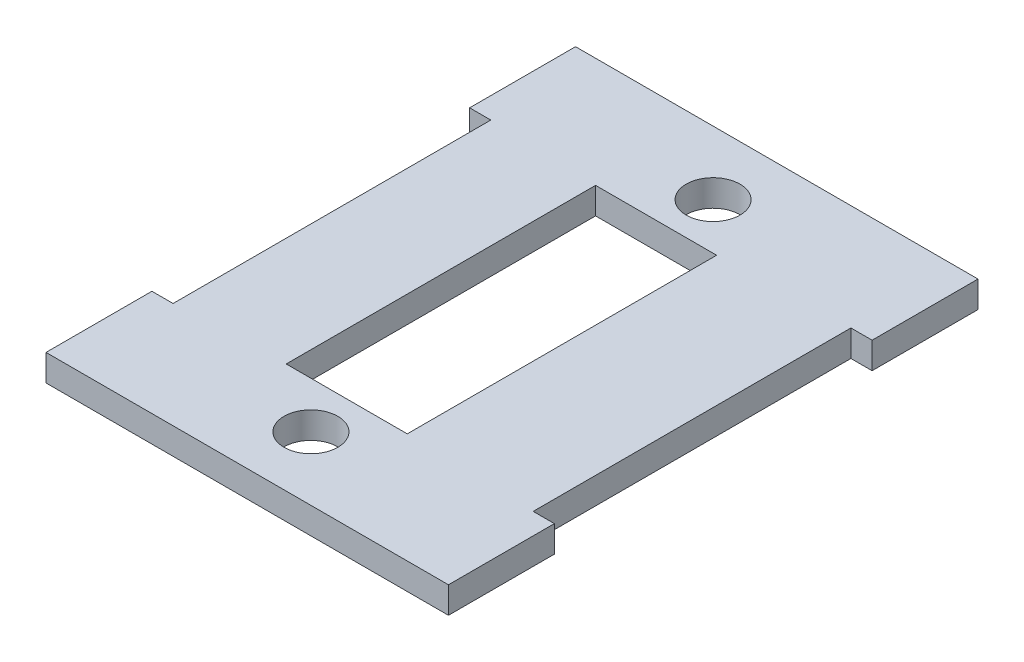
ISO-10303-21;
HEADER;
FILE_DESCRIPTION(('STEP AP214'),'2;1');
FILE_NAME('part.step','',(''),(''),'','','');
FILE_SCHEMA(('AUTOMOTIVE_DESIGN { 1 0 10303 214 1 1 1 1 }'));
ENDSEC;
DATA;
#1=APPLICATION_CONTEXT('core data for automotive mechanical design processes');
#2=APPLICATION_PROTOCOL_DEFINITION('international standard','automotive_design',2000,#1);
#3=PRODUCT_CONTEXT('',#1,'mechanical');
#4=PRODUCT('Part','Part','',(#3));
#5=PRODUCT_RELATED_PRODUCT_CATEGORY('part','',(#4));
#6=PRODUCT_DEFINITION_FORMATION('','',#4);
#7=PRODUCT_DEFINITION_CONTEXT('part definition',#1,'design');
#8=PRODUCT_DEFINITION('design','',#6,#7);
#9=PRODUCT_DEFINITION_SHAPE('','',#8);
#10=(LENGTH_UNIT() NAMED_UNIT(*) SI_UNIT(.MILLI.,.METRE.));
#11=(NAMED_UNIT(*) PLANE_ANGLE_UNIT() SI_UNIT($,.RADIAN.));
#12=(NAMED_UNIT(*) SI_UNIT($,.STERADIAN.) SOLID_ANGLE_UNIT());
#13=UNCERTAINTY_MEASURE_WITH_UNIT(LENGTH_MEASURE(1.E-05),#10,'distance_accuracy_value','');
#14=(GEOMETRIC_REPRESENTATION_CONTEXT(3) GLOBAL_UNCERTAINTY_ASSIGNED_CONTEXT((#13)) GLOBAL_UNIT_ASSIGNED_CONTEXT((#10,
#11,#12)) REPRESENTATION_CONTEXT('',''));
#15=CARTESIAN_POINT('',(0.,0.,0.));
#16=DIRECTION('',(0.,0.,1.));
#17=DIRECTION('',(1.,0.,0.));
#18=AXIS2_PLACEMENT_3D('',#15,#16,#17);
#19=CARTESIAN_POINT('',(20.,1.25,-15.));
#20=DIRECTION('',(0.,-1.,0.));
#21=DIRECTION('',(0.,0.,-1.));
#22=AXIS2_PLACEMENT_3D('',#19,#20,#21);
#23=PLANE('',#22);
#24=CARTESIAN_POINT('',(1.00000000000147,1.25,-18.9853700863915));
#25=DIRECTION('',(0.,1.,0.));
#26=DIRECTION('',(0.,0.,1.));
#27=AXIS2_PLACEMENT_3D('',#24,#25,#26);
#28=CIRCLE('',#27,2.53999999999995);
#29=CARTESIAN_POINT('',(1.00000000000147,1.25,-16.4453700863915));
#30=VERTEX_POINT('',#29);
#31=EDGE_CURVE('E173',#30,#30,#28,.T.);
#32=ORIENTED_EDGE('',*,*,#31,.F.);
#33=EDGE_LOOP('',(#32));
#34=FACE_BOUND('',#33,.T.);
#35=DIRECTION('',(0.,0.,-1.));
#36=VECTOR('',#35,1.);
#37=CARTESIAN_POINT('',(20.,1.25,-25.));
#38=LINE('',#37,#36);
#39=CARTESIAN_POINT('',(20.,1.25,-15.));
#40=VERTEX_POINT('',#39);
#41=CARTESIAN_POINT('',(20.,1.25,-25.));
#42=VERTEX_POINT('',#41);
#43=EDGE_CURVE('E183',#40,#42,#38,.T.);
#44=ORIENTED_EDGE('',*,*,#43,.T.);
#45=DIRECTION('',(-1.,0.,0.));
#46=VECTOR('',#45,1.);
#47=CARTESIAN_POINT('',(20.,1.25,-25.));
#48=LINE('',#47,#46);
#49=CARTESIAN_POINT('',(-18.,1.25,-25.));
#50=VERTEX_POINT('',#49);
#51=EDGE_CURVE('E186',#42,#50,#48,.T.);
#52=ORIENTED_EDGE('',*,*,#51,.T.);
#53=DIRECTION('',(0.,0.,1.));
#54=VECTOR('',#53,1.);
#55=CARTESIAN_POINT('',(-18.,1.25,-25.));
#56=LINE('',#55,#54);
#57=CARTESIAN_POINT('',(-18.,1.25,-15.));
#58=VERTEX_POINT('',#57);
#59=EDGE_CURVE('E189',#50,#58,#56,.T.);
#60=ORIENTED_EDGE('',*,*,#59,.T.);
#61=DIRECTION('',(1.,0.,0.));
#62=VECTOR('',#61,1.);
#63=CARTESIAN_POINT('',(-18.,1.25,-15.));
#64=LINE('',#63,#62);
#65=CARTESIAN_POINT('',(-16.,1.25,-15.));
#66=VERTEX_POINT('',#65);
#67=EDGE_CURVE('E191',#58,#66,#64,.T.);
#68=ORIENTED_EDGE('',*,*,#67,.T.);
#69=DIRECTION('',(0.,0.,1.));
#70=VECTOR('',#69,1.);
#71=CARTESIAN_POINT('',(-16.,1.25,15.));
#72=LINE('',#71,#70);
#73=CARTESIAN_POINT('',(-16.,1.25,15.));
#74=VERTEX_POINT('',#73);
#75=EDGE_CURVE('E193',#66,#74,#72,.T.);
#76=ORIENTED_EDGE('',*,*,#75,.T.);
#77=DIRECTION('',(-1.,0.,0.));
#78=VECTOR('',#77,1.);
#79=CARTESIAN_POINT('',(-18.,1.25,15.));
#80=LINE('',#79,#78);
#81=CARTESIAN_POINT('',(-18.,1.25,15.));
#82=VERTEX_POINT('',#81);
#83=EDGE_CURVE('E195',#74,#82,#80,.T.);
#84=ORIENTED_EDGE('',*,*,#83,.T.);
#85=DIRECTION('',(0.,0.,1.));
#86=VECTOR('',#85,1.);
#87=CARTESIAN_POINT('',(-18.,1.25,25.));
#88=LINE('',#87,#86);
#89=CARTESIAN_POINT('',(-18.,1.25,25.));
#90=VERTEX_POINT('',#89);
#91=EDGE_CURVE('E197',#82,#90,#88,.T.);
#92=ORIENTED_EDGE('',*,*,#91,.T.);
#93=DIRECTION('',(1.,0.,0.));
#94=VECTOR('',#93,1.);
#95=CARTESIAN_POINT('',(-18.,1.25,25.));
#96=LINE('',#95,#94);
#97=CARTESIAN_POINT('',(20.,1.25,25.));
#98=VERTEX_POINT('',#97);
#99=EDGE_CURVE('E199',#90,#98,#96,.T.);
#100=ORIENTED_EDGE('',*,*,#99,.T.);
#101=DIRECTION('',(0.,0.,-1.));
#102=VECTOR('',#101,1.);
#103=CARTESIAN_POINT('',(20.,1.25,25.));
#104=LINE('',#103,#102);
#105=CARTESIAN_POINT('',(20.,1.25,15.));
#106=VERTEX_POINT('',#105);
#107=EDGE_CURVE('E201',#98,#106,#104,.T.);
#108=ORIENTED_EDGE('',*,*,#107,.T.);
#109=DIRECTION('',(-1.,0.,0.));
#110=VECTOR('',#109,1.);
#111=CARTESIAN_POINT('',(20.,1.25,15.));
#112=LINE('',#111,#110);
#113=CARTESIAN_POINT('',(18.,1.25,15.));
#114=VERTEX_POINT('',#113);
#115=EDGE_CURVE('E203',#106,#114,#112,.T.);
#116=ORIENTED_EDGE('',*,*,#115,.T.);
#117=DIRECTION('',(0.,0.,-1.));
#118=VECTOR('',#117,1.);
#119=CARTESIAN_POINT('',(18.,1.25,15.));
#120=LINE('',#119,#118);
#121=CARTESIAN_POINT('',(18.,1.25,-15.));
#122=VERTEX_POINT('',#121);
#123=EDGE_CURVE('E205',#114,#122,#120,.T.);
#124=ORIENTED_EDGE('',*,*,#123,.T.);
#125=DIRECTION('',(1.,0.,0.));
#126=VECTOR('',#125,1.);
#127=CARTESIAN_POINT('',(20.,1.25,-15.));
#128=LINE('',#127,#126);
#129=EDGE_CURVE('E207',#122,#40,#128,.T.);
#130=ORIENTED_EDGE('',*,*,#129,.T.);
#131=EDGE_LOOP('',(#44,#52,#60,#68,#76,#84,#92,#100,#108,#116,#124,#130));
#132=FACE_BOUND('',#131,.T.);
#133=DIRECTION('',(0.,0.,1.));
#134=VECTOR('',#133,1.);
#135=CARTESIAN_POINT('',(-5.715,1.25,14.605));
#136=LINE('',#135,#134);
#137=CARTESIAN_POINT('',(-5.715,1.25,-14.605));
#138=VERTEX_POINT('',#137);
#139=CARTESIAN_POINT('',(-5.715,1.25,14.605));
#140=VERTEX_POINT('',#139);
#141=EDGE_CURVE('E144',#138,#140,#136,.T.);
#142=ORIENTED_EDGE('',*,*,#141,.F.);
#143=DIRECTION('',(-1.,0.,0.));
#144=VECTOR('',#143,1.);
#145=CARTESIAN_POINT('',(5.715,1.25,-14.605));
#146=LINE('',#145,#144);
#147=CARTESIAN_POINT('',(5.715,1.25,-14.605));
#148=VERTEX_POINT('',#147);
#149=EDGE_CURVE('E167',#148,#138,#146,.T.);
#150=ORIENTED_EDGE('',*,*,#149,.F.);
#151=DIRECTION('',(0.,0.,-1.));
#152=VECTOR('',#151,1.);
#153=CARTESIAN_POINT('',(5.715,1.25,14.605));
#154=LINE('',#153,#152);
#155=CARTESIAN_POINT('',(5.715,1.25,14.605));
#156=VERTEX_POINT('',#155);
#157=EDGE_CURVE('E165',#156,#148,#154,.T.);
#158=ORIENTED_EDGE('',*,*,#157,.F.);
#159=DIRECTION('',(1.,0.,0.));
#160=VECTOR('',#159,1.);
#161=CARTESIAN_POINT('',(5.715,1.25,14.605));
#162=LINE('',#161,#160);
#163=EDGE_CURVE('E152',#140,#156,#162,.T.);
#164=ORIENTED_EDGE('',*,*,#163,.F.);
#165=EDGE_LOOP('',(#142,#150,#158,#164));
#166=FACE_BOUND('',#165,.T.);
#167=CARTESIAN_POINT('',(1.00000000000147,1.25,18.9853700863915));
#168=DIRECTION('',(0.,1.,0.));
#169=DIRECTION('',(0.,0.,1.));
#170=AXIS2_PLACEMENT_3D('',#167,#168,#169);
#171=CIRCLE('',#170,2.54000000000003);
#172=CARTESIAN_POINT('',(1.00000000000147,1.25,21.5253700863915));
#173=VERTEX_POINT('',#172);
#174=EDGE_CURVE('E494',#173,#173,#171,.T.);
#175=ORIENTED_EDGE('',*,*,#174,.F.);
#176=EDGE_LOOP('',(#175));
#177=FACE_BOUND('',#176,.T.);
#178=ADVANCED_FACE('F31',(#34,#132,#166,#177),#23,.F.);
#179=CARTESIAN_POINT('',(20.,-1.25,-15.));
#180=DIRECTION('',(0.,-1.,0.));
#181=DIRECTION('',(0.,0.,-1.));
#182=AXIS2_PLACEMENT_3D('',#179,#180,#181);
#183=PLANE('',#182);
#184=CARTESIAN_POINT('',(1.00000000000147,-1.25,-18.9853700863915));
#185=DIRECTION('',(0.,1.,0.));
#186=DIRECTION('',(0.,0.,1.));
#187=AXIS2_PLACEMENT_3D('',#184,#185,#186);
#188=CIRCLE('',#187,2.53999999999995);
#189=CARTESIAN_POINT('',(1.00000000000147,-1.25,-16.4453700863915));
#190=VERTEX_POINT('',#189);
#191=EDGE_CURVE('E500',#190,#190,#188,.T.);
#192=ORIENTED_EDGE('',*,*,#191,.T.);
#193=EDGE_LOOP('',(#192));
#194=FACE_BOUND('',#193,.T.);
#195=DIRECTION('',(0.,0.,-1.));
#196=VECTOR('',#195,1.);
#197=CARTESIAN_POINT('',(20.,-1.25,-25.));
#198=LINE('',#197,#196);
#199=CARTESIAN_POINT('',(20.,-1.25,-15.));
#200=VERTEX_POINT('',#199);
#201=CARTESIAN_POINT('',(20.,-1.25,-25.));
#202=VERTEX_POINT('',#201);
#203=EDGE_CURVE('E160',#200,#202,#198,.T.);
#204=ORIENTED_EDGE('',*,*,#203,.F.);
#205=DIRECTION('',(1.,0.,0.));
#206=VECTOR('',#205,1.);
#207=CARTESIAN_POINT('',(20.,-1.25,-15.));
#208=LINE('',#207,#206);
#209=CARTESIAN_POINT('',(18.,-1.25,-15.));
#210=VERTEX_POINT('',#209);
#211=EDGE_CURVE('E187',#210,#200,#208,.T.);
#212=ORIENTED_EDGE('',*,*,#211,.F.);
#213=DIRECTION('',(0.,0.,-1.));
#214=VECTOR('',#213,1.);
#215=CARTESIAN_POINT('',(18.,-1.25,15.));
#216=LINE('',#215,#214);
#217=CARTESIAN_POINT('',(18.,-1.25,15.));
#218=VERTEX_POINT('',#217);
#219=EDGE_CURVE('E230',#218,#210,#216,.T.);
#220=ORIENTED_EDGE('',*,*,#219,.F.);
#221=DIRECTION('',(-1.,0.,0.));
#222=VECTOR('',#221,1.);
#223=CARTESIAN_POINT('',(20.,-1.25,15.));
#224=LINE('',#223,#222);
#225=CARTESIAN_POINT('',(20.,-1.25,15.));
#226=VERTEX_POINT('',#225);
#227=EDGE_CURVE('E228',#226,#218,#224,.T.);
#228=ORIENTED_EDGE('',*,*,#227,.F.);
#229=DIRECTION('',(0.,0.,-1.));
#230=VECTOR('',#229,1.);
#231=CARTESIAN_POINT('',(20.,-1.25,25.));
#232=LINE('',#231,#230);
#233=CARTESIAN_POINT('',(20.,-1.25,25.));
#234=VERTEX_POINT('',#233);
#235=EDGE_CURVE('E226',#234,#226,#232,.T.);
#236=ORIENTED_EDGE('',*,*,#235,.F.);
#237=DIRECTION('',(1.,0.,0.));
#238=VECTOR('',#237,1.);
#239=CARTESIAN_POINT('',(-18.,-1.25,25.));
#240=LINE('',#239,#238);
#241=CARTESIAN_POINT('',(-18.,-1.25,25.));
#242=VERTEX_POINT('',#241);
#243=EDGE_CURVE('E224',#242,#234,#240,.T.);
#244=ORIENTED_EDGE('',*,*,#243,.F.);
#245=DIRECTION('',(0.,0.,1.));
#246=VECTOR('',#245,1.);
#247=CARTESIAN_POINT('',(-18.,-1.25,25.));
#248=LINE('',#247,#246);
#249=CARTESIAN_POINT('',(-18.,-1.25,15.));
#250=VERTEX_POINT('',#249);
#251=EDGE_CURVE('E222',#250,#242,#248,.T.);
#252=ORIENTED_EDGE('',*,*,#251,.F.);
#253=DIRECTION('',(-1.,0.,0.));
#254=VECTOR('',#253,1.);
#255=CARTESIAN_POINT('',(-18.,-1.25,15.));
#256=LINE('',#255,#254);
#257=CARTESIAN_POINT('',(-16.,-1.25,15.));
#258=VERTEX_POINT('',#257);
#259=EDGE_CURVE('E220',#258,#250,#256,.T.);
#260=ORIENTED_EDGE('',*,*,#259,.F.);
#261=DIRECTION('',(0.,0.,1.));
#262=VECTOR('',#261,1.);
#263=CARTESIAN_POINT('',(-16.,-1.25,15.));
#264=LINE('',#263,#262);
#265=CARTESIAN_POINT('',(-16.,-1.25,-15.));
#266=VERTEX_POINT('',#265);
#267=EDGE_CURVE('E218',#266,#258,#264,.T.);
#268=ORIENTED_EDGE('',*,*,#267,.F.);
#269=DIRECTION('',(1.,0.,0.));
#270=VECTOR('',#269,1.);
#271=CARTESIAN_POINT('',(-18.,-1.25,-15.));
#272=LINE('',#271,#270);
#273=CARTESIAN_POINT('',(-18.,-1.25,-15.));
#274=VERTEX_POINT('',#273);
#275=EDGE_CURVE('E216',#274,#266,#272,.T.);
#276=ORIENTED_EDGE('',*,*,#275,.F.);
#277=DIRECTION('',(0.,0.,1.));
#278=VECTOR('',#277,1.);
#279=CARTESIAN_POINT('',(-18.,-1.25,-25.));
#280=LINE('',#279,#278);
#281=CARTESIAN_POINT('',(-18.,-1.25,-25.));
#282=VERTEX_POINT('',#281);
#283=EDGE_CURVE('E214',#282,#274,#280,.T.);
#284=ORIENTED_EDGE('',*,*,#283,.F.);
#285=DIRECTION('',(-1.,0.,0.));
#286=VECTOR('',#285,1.);
#287=CARTESIAN_POINT('',(20.,-1.25,-25.));
#288=LINE('',#287,#286);
#289=EDGE_CURVE('E212',#202,#282,#288,.T.);
#290=ORIENTED_EDGE('',*,*,#289,.F.);
#291=EDGE_LOOP('',(#204,#212,#220,#228,#236,#244,#252,#260,#268,#276,#284,#290));
#292=FACE_BOUND('',#291,.T.);
#293=DIRECTION('',(-1.,0.,0.));
#294=VECTOR('',#293,1.);
#295=CARTESIAN_POINT('',(5.715,-1.25,-14.605));
#296=LINE('',#295,#294);
#297=CARTESIAN_POINT('',(5.715,-1.25,-14.605));
#298=VERTEX_POINT('',#297);
#299=CARTESIAN_POINT('',(-5.71499999999999,-1.25,-14.605));
#300=VERTEX_POINT('',#299);
#301=EDGE_CURVE('E153',#298,#300,#296,.T.);
#302=ORIENTED_EDGE('',*,*,#301,.T.);
#303=DIRECTION('',(0.,0.,1.));
#304=VECTOR('',#303,1.);
#305=CARTESIAN_POINT('',(-5.715,-1.25,14.605));
#306=LINE('',#305,#304);
#307=CARTESIAN_POINT('',(-5.715,-1.25,14.605));
#308=VERTEX_POINT('',#307);
#309=EDGE_CURVE('E54',#300,#308,#306,.T.);
#310=ORIENTED_EDGE('',*,*,#309,.T.);
#311=DIRECTION('',(1.,0.,0.));
#312=VECTOR('',#311,1.);
#313=CARTESIAN_POINT('',(5.715,-1.25,14.605));
#314=LINE('',#313,#312);
#315=CARTESIAN_POINT('',(5.715,-1.25,14.605));
#316=VERTEX_POINT('',#315);
#317=EDGE_CURVE('E159',#308,#316,#314,.T.);
#318=ORIENTED_EDGE('',*,*,#317,.T.);
#319=DIRECTION('',(0.,0.,-1.));
#320=VECTOR('',#319,1.);
#321=CARTESIAN_POINT('',(5.715,-1.25,14.605));
#322=LINE('',#321,#320);
#323=EDGE_CURVE('E175',#316,#298,#322,.T.);
#324=ORIENTED_EDGE('',*,*,#323,.T.);
#325=EDGE_LOOP('',(#302,#310,#318,#324));
#326=FACE_BOUND('',#325,.T.);
#327=CARTESIAN_POINT('',(1.00000000000147,-1.25,18.9853700863915));
#328=DIRECTION('',(0.,1.,0.));
#329=DIRECTION('',(0.,0.,1.));
#330=AXIS2_PLACEMENT_3D('',#327,#328,#329);
#331=CIRCLE('',#330,2.54000000000003);
#332=CARTESIAN_POINT('',(1.00000000000147,-1.25,21.5253700863915));
#333=VERTEX_POINT('',#332);
#334=EDGE_CURVE('E497',#333,#333,#331,.T.);
#335=ORIENTED_EDGE('',*,*,#334,.T.);
#336=EDGE_LOOP('',(#335));
#337=FACE_BOUND('',#336,.T.);
#338=ADVANCED_FACE('F272',(#194,#292,#326,#337),#183,.T.);
#339=CARTESIAN_POINT('',(20.,1.25,-25.));
#340=DIRECTION('',(-1.,0.,0.));
#341=DIRECTION('',(0.,0.,1.));
#342=AXIS2_PLACEMENT_3D('',#339,#340,#341);
#343=PLANE('',#342);
#344=ORIENTED_EDGE('',*,*,#203,.T.);
#345=DIRECTION('',(0.,-1.,0.));
#346=VECTOR('',#345,1.);
#347=CARTESIAN_POINT('',(20.,1.25,-25.));
#348=LINE('',#347,#346);
#349=EDGE_CURVE('E11',#42,#202,#348,.T.);
#350=ORIENTED_EDGE('',*,*,#349,.F.);
#351=ORIENTED_EDGE('',*,*,#43,.F.);
#352=DIRECTION('',(0.,-1.,0.));
#353=VECTOR('',#352,1.);
#354=CARTESIAN_POINT('',(20.,1.25,-15.));
#355=LINE('',#354,#353);
#356=EDGE_CURVE('E209',#40,#200,#355,.T.);
#357=ORIENTED_EDGE('',*,*,#356,.T.);
#358=EDGE_LOOP('',(#344,#350,#351,#357));
#359=FACE_BOUND('',#358,.T.);
#360=ADVANCED_FACE('F33',(#359),#343,.F.);
#361=CARTESIAN_POINT('',(20.,1.25,-25.));
#362=DIRECTION('',(0.,0.,1.));
#363=DIRECTION('',(1.,0.,0.));
#364=AXIS2_PLACEMENT_3D('',#361,#362,#363);
#365=PLANE('',#364);
#366=ORIENTED_EDGE('',*,*,#289,.T.);
#367=DIRECTION('',(0.,-1.,0.));
#368=VECTOR('',#367,1.);
#369=CARTESIAN_POINT('',(-18.,1.25,-25.));
#370=LINE('',#369,#368);
#371=EDGE_CURVE('E39',#50,#282,#370,.T.);
#372=ORIENTED_EDGE('',*,*,#371,.F.);
#373=ORIENTED_EDGE('',*,*,#51,.F.);
#374=ORIENTED_EDGE('',*,*,#349,.T.);
#375=EDGE_LOOP('',(#366,#372,#373,#374));
#376=FACE_BOUND('',#375,.T.);
#377=ADVANCED_FACE('F289',(#376),#365,.F.);
#378=CARTESIAN_POINT('',(-18.,1.25,-25.));
#379=DIRECTION('',(1.,0.,0.));
#380=DIRECTION('',(0.,0.,-1.));
#381=AXIS2_PLACEMENT_3D('',#378,#379,#380);
#382=PLANE('',#381);
#383=ORIENTED_EDGE('',*,*,#283,.T.);
#384=DIRECTION('',(0.,-1.,0.));
#385=VECTOR('',#384,1.);
#386=CARTESIAN_POINT('',(-18.,1.25,-15.));
#387=LINE('',#386,#385);
#388=EDGE_CURVE('E259',#58,#274,#387,.T.);
#389=ORIENTED_EDGE('',*,*,#388,.F.);
#390=ORIENTED_EDGE('',*,*,#59,.F.);
#391=ORIENTED_EDGE('',*,*,#371,.T.);
#392=EDGE_LOOP('',(#383,#389,#390,#391));
#393=FACE_BOUND('',#392,.T.);
#394=ADVANCED_FACE('F266',(#393),#382,.F.);
#395=CARTESIAN_POINT('',(-18.,1.25,-15.));
#396=DIRECTION('',(0.,0.,-1.));
#397=DIRECTION('',(-1.,0.,0.));
#398=AXIS2_PLACEMENT_3D('',#395,#396,#397);
#399=PLANE('',#398);
#400=ORIENTED_EDGE('',*,*,#275,.T.);
#401=DIRECTION('',(0.,-1.,0.));
#402=VECTOR('',#401,1.);
#403=CARTESIAN_POINT('',(-16.,1.25,-15.));
#404=LINE('',#403,#402);
#405=EDGE_CURVE('E256',#66,#266,#404,.T.);
#406=ORIENTED_EDGE('',*,*,#405,.F.);
#407=ORIENTED_EDGE('',*,*,#67,.F.);
#408=ORIENTED_EDGE('',*,*,#388,.T.);
#409=EDGE_LOOP('',(#400,#406,#407,#408));
#410=FACE_BOUND('',#409,.T.);
#411=ADVANCED_FACE('F278',(#410),#399,.F.);
#412=CARTESIAN_POINT('',(-16.,1.25,15.));
#413=DIRECTION('',(1.,0.,0.));
#414=DIRECTION('',(0.,0.,-1.));
#415=AXIS2_PLACEMENT_3D('',#412,#413,#414);
#416=PLANE('',#415);
#417=ORIENTED_EDGE('',*,*,#267,.T.);
#418=DIRECTION('',(0.,-1.,0.));
#419=VECTOR('',#418,1.);
#420=CARTESIAN_POINT('',(-16.,1.25,15.));
#421=LINE('',#420,#419);
#422=EDGE_CURVE('E253',#74,#258,#421,.T.);
#423=ORIENTED_EDGE('',*,*,#422,.F.);
#424=ORIENTED_EDGE('',*,*,#75,.F.);
#425=ORIENTED_EDGE('',*,*,#405,.T.);
#426=EDGE_LOOP('',(#417,#423,#424,#425));
#427=FACE_BOUND('',#426,.T.);
#428=ADVANCED_FACE('F282',(#427),#416,.F.);
#429=CARTESIAN_POINT('',(-18.,1.25,15.));
#430=DIRECTION('',(0.,0.,1.));
#431=DIRECTION('',(1.,0.,0.));
#432=AXIS2_PLACEMENT_3D('',#429,#430,#431);
#433=PLANE('',#432);
#434=ORIENTED_EDGE('',*,*,#259,.T.);
#435=DIRECTION('',(0.,-1.,0.));
#436=VECTOR('',#435,1.);
#437=CARTESIAN_POINT('',(-18.,1.25,15.));
#438=LINE('',#437,#436);
#439=EDGE_CURVE('E250',#82,#250,#438,.T.);
#440=ORIENTED_EDGE('',*,*,#439,.F.);
#441=ORIENTED_EDGE('',*,*,#83,.F.);
#442=ORIENTED_EDGE('',*,*,#422,.T.);
#443=EDGE_LOOP('',(#434,#440,#441,#442));
#444=FACE_BOUND('',#443,.T.);
#445=ADVANCED_FACE('F322',(#444),#433,.F.);
#446=CARTESIAN_POINT('',(-18.,1.25,25.));
#447=DIRECTION('',(1.,0.,0.));
#448=DIRECTION('',(0.,0.,-1.));
#449=AXIS2_PLACEMENT_3D('',#446,#447,#448);
#450=PLANE('',#449);
#451=ORIENTED_EDGE('',*,*,#251,.T.);
#452=DIRECTION('',(0.,-1.,0.));
#453=VECTOR('',#452,1.);
#454=CARTESIAN_POINT('',(-18.,1.25,25.));
#455=LINE('',#454,#453);
#456=EDGE_CURVE('E247',#90,#242,#455,.T.);
#457=ORIENTED_EDGE('',*,*,#456,.F.);
#458=ORIENTED_EDGE('',*,*,#91,.F.);
#459=ORIENTED_EDGE('',*,*,#439,.T.);
#460=EDGE_LOOP('',(#451,#457,#458,#459));
#461=FACE_BOUND('',#460,.T.);
#462=ADVANCED_FACE('F320',(#461),#450,.F.);
#463=CARTESIAN_POINT('',(-18.,1.25,25.));
#464=DIRECTION('',(0.,0.,-1.));
#465=DIRECTION('',(-1.,0.,0.));
#466=AXIS2_PLACEMENT_3D('',#463,#464,#465);
#467=PLANE('',#466);
#468=ORIENTED_EDGE('',*,*,#243,.T.);
#469=DIRECTION('',(0.,-1.,0.));
#470=VECTOR('',#469,1.);
#471=CARTESIAN_POINT('',(20.,1.25,25.));
#472=LINE('',#471,#470);
#473=EDGE_CURVE('E244',#98,#234,#472,.T.);
#474=ORIENTED_EDGE('',*,*,#473,.F.);
#475=ORIENTED_EDGE('',*,*,#99,.F.);
#476=ORIENTED_EDGE('',*,*,#456,.T.);
#477=EDGE_LOOP('',(#468,#474,#475,#476));
#478=FACE_BOUND('',#477,.T.);
#479=ADVANCED_FACE('F316',(#478),#467,.F.);
#480=CARTESIAN_POINT('',(20.,1.25,25.));
#481=DIRECTION('',(-1.,0.,0.));
#482=DIRECTION('',(0.,0.,1.));
#483=AXIS2_PLACEMENT_3D('',#480,#481,#482);
#484=PLANE('',#483);
#485=ORIENTED_EDGE('',*,*,#235,.T.);
#486=DIRECTION('',(0.,-1.,0.));
#487=VECTOR('',#486,1.);
#488=CARTESIAN_POINT('',(20.,1.25,15.));
#489=LINE('',#488,#487);
#490=EDGE_CURVE('E241',#106,#226,#489,.T.);
#491=ORIENTED_EDGE('',*,*,#490,.F.);
#492=ORIENTED_EDGE('',*,*,#107,.F.);
#493=ORIENTED_EDGE('',*,*,#473,.T.);
#494=EDGE_LOOP('',(#485,#491,#492,#493));
#495=FACE_BOUND('',#494,.T.);
#496=ADVANCED_FACE('F311',(#495),#484,.F.);
#497=CARTESIAN_POINT('',(20.,1.25,15.));
#498=DIRECTION('',(0.,0.,1.));
#499=DIRECTION('',(1.,0.,0.));
#500=AXIS2_PLACEMENT_3D('',#497,#498,#499);
#501=PLANE('',#500);
#502=ORIENTED_EDGE('',*,*,#227,.T.);
#503=DIRECTION('',(0.,-1.,0.));
#504=VECTOR('',#503,1.);
#505=CARTESIAN_POINT('',(18.,1.25,15.));
#506=LINE('',#505,#504);
#507=EDGE_CURVE('E238',#114,#218,#506,.T.);
#508=ORIENTED_EDGE('',*,*,#507,.F.);
#509=ORIENTED_EDGE('',*,*,#115,.F.);
#510=ORIENTED_EDGE('',*,*,#490,.T.);
#511=EDGE_LOOP('',(#502,#508,#509,#510));
#512=FACE_BOUND('',#511,.T.);
#513=ADVANCED_FACE('F305',(#512),#501,.F.);
#514=CARTESIAN_POINT('',(18.,1.25,15.));
#515=DIRECTION('',(-1.,0.,0.));
#516=DIRECTION('',(0.,0.,1.));
#517=AXIS2_PLACEMENT_3D('',#514,#515,#516);
#518=PLANE('',#517);
#519=ORIENTED_EDGE('',*,*,#219,.T.);
#520=DIRECTION('',(0.,-1.,0.));
#521=VECTOR('',#520,1.);
#522=CARTESIAN_POINT('',(18.,1.25,-15.));
#523=LINE('',#522,#521);
#524=EDGE_CURVE('E235',#122,#210,#523,.T.);
#525=ORIENTED_EDGE('',*,*,#524,.F.);
#526=ORIENTED_EDGE('',*,*,#123,.F.);
#527=ORIENTED_EDGE('',*,*,#507,.T.);
#528=EDGE_LOOP('',(#519,#525,#526,#527));
#529=FACE_BOUND('',#528,.T.);
#530=ADVANCED_FACE('F301',(#529),#518,.F.);
#531=CARTESIAN_POINT('',(20.,1.25,-15.));
#532=DIRECTION('',(0.,0.,-1.));
#533=DIRECTION('',(-1.,0.,0.));
#534=AXIS2_PLACEMENT_3D('',#531,#532,#533);
#535=PLANE('',#534);
#536=ORIENTED_EDGE('',*,*,#211,.T.);
#537=ORIENTED_EDGE('',*,*,#356,.F.);
#538=ORIENTED_EDGE('',*,*,#129,.F.);
#539=ORIENTED_EDGE('',*,*,#524,.T.);
#540=EDGE_LOOP('',(#536,#537,#538,#539));
#541=FACE_BOUND('',#540,.T.);
#542=ADVANCED_FACE('F296',(#541),#535,.F.);
#543=CARTESIAN_POINT('',(-5.715,1.25,14.605));
#544=DIRECTION('',(1.,0.,0.));
#545=DIRECTION('',(0.,0.,-1.));
#546=AXIS2_PLACEMENT_3D('',#543,#544,#545);
#547=PLANE('',#546);
#548=ORIENTED_EDGE('',*,*,#309,.F.);
#549=DIRECTION('',(0.,-1.,0.));
#550=VECTOR('',#549,1.);
#551=CARTESIAN_POINT('',(-5.715,1.25,-14.605));
#552=LINE('',#551,#550);
#553=EDGE_CURVE('E148',#138,#300,#552,.T.);
#554=ORIENTED_EDGE('',*,*,#553,.F.);
#555=ORIENTED_EDGE('',*,*,#141,.T.);
#556=DIRECTION('',(0.,-1.,0.));
#557=VECTOR('',#556,1.);
#558=CARTESIAN_POINT('',(-5.715,1.25,14.605));
#559=LINE('',#558,#557);
#560=EDGE_CURVE('E147',#140,#308,#559,.T.);
#561=ORIENTED_EDGE('',*,*,#560,.T.);
#562=EDGE_LOOP('',(#548,#554,#555,#561));
#563=FACE_BOUND('',#562,.T.);
#564=ADVANCED_FACE('F146',(#563),#547,.T.);
#565=CARTESIAN_POINT('',(5.715,1.25,14.605));
#566=DIRECTION('',(0.,0.,-1.));
#567=DIRECTION('',(-1.,0.,0.));
#568=AXIS2_PLACEMENT_3D('',#565,#566,#567);
#569=PLANE('',#568);
#570=ORIENTED_EDGE('',*,*,#317,.F.);
#571=ORIENTED_EDGE('',*,*,#560,.F.);
#572=ORIENTED_EDGE('',*,*,#163,.T.);
#573=DIRECTION('',(0.,-1.,0.));
#574=VECTOR('',#573,1.);
#575=CARTESIAN_POINT('',(5.715,1.25,14.605));
#576=LINE('',#575,#574);
#577=EDGE_CURVE('E161',#156,#316,#576,.T.);
#578=ORIENTED_EDGE('',*,*,#577,.T.);
#579=EDGE_LOOP('',(#570,#571,#572,#578));
#580=FACE_BOUND('',#579,.T.);
#581=ADVANCED_FACE('F156',(#580),#569,.T.);
#582=CARTESIAN_POINT('',(5.715,1.25,14.605));
#583=DIRECTION('',(-1.,0.,0.));
#584=DIRECTION('',(0.,0.,1.));
#585=AXIS2_PLACEMENT_3D('',#582,#583,#584);
#586=PLANE('',#585);
#587=ORIENTED_EDGE('',*,*,#323,.F.);
#588=ORIENTED_EDGE('',*,*,#577,.F.);
#589=ORIENTED_EDGE('',*,*,#157,.T.);
#590=DIRECTION('',(0.,-1.,0.));
#591=VECTOR('',#590,1.);
#592=CARTESIAN_POINT('',(5.715,1.25,-14.605));
#593=LINE('',#592,#591);
#594=EDGE_CURVE('E46',#148,#298,#593,.T.);
#595=ORIENTED_EDGE('',*,*,#594,.T.);
#596=EDGE_LOOP('',(#587,#588,#589,#595));
#597=FACE_BOUND('',#596,.T.);
#598=ADVANCED_FACE('F383',(#597),#586,.T.);
#599=CARTESIAN_POINT('',(5.715,1.25,-14.605));
#600=DIRECTION('',(0.,0.,1.));
#601=DIRECTION('',(1.,0.,0.));
#602=AXIS2_PLACEMENT_3D('',#599,#600,#601);
#603=PLANE('',#602);
#604=ORIENTED_EDGE('',*,*,#301,.F.);
#605=ORIENTED_EDGE('',*,*,#594,.F.);
#606=ORIENTED_EDGE('',*,*,#149,.T.);
#607=ORIENTED_EDGE('',*,*,#553,.T.);
#608=EDGE_LOOP('',(#604,#605,#606,#607));
#609=FACE_BOUND('',#608,.T.);
#610=ADVANCED_FACE('F389',(#609),#603,.T.);
#611=CARTESIAN_POINT('',(1.00000000000147,1.25,-18.9853700863915));
#612=DIRECTION('',(0.,-1.,0.));
#613=DIRECTION('',(0.,0.,-1.));
#614=AXIS2_PLACEMENT_3D('',#611,#612,#613);
#615=CYLINDRICAL_SURFACE('',#614,2.53999999999995);
#616=ORIENTED_EDGE('',*,*,#31,.T.);
#617=EDGE_LOOP('',(#616));
#618=FACE_BOUND('',#617,.T.);
#619=ORIENTED_EDGE('',*,*,#191,.F.);
#620=EDGE_LOOP('',(#619));
#621=FACE_BOUND('',#620,.T.);
#622=ADVANCED_FACE('F397',(#618,#621),#615,.F.);
#623=CARTESIAN_POINT('',(1.00000000000147,1.25,18.9853700863915));
#624=DIRECTION('',(0.,-1.,0.));
#625=DIRECTION('',(0.,0.,-1.));
#626=AXIS2_PLACEMENT_3D('',#623,#624,#625);
#627=CYLINDRICAL_SURFACE('',#626,2.54000000000003);
#628=ORIENTED_EDGE('',*,*,#174,.T.);
#629=EDGE_LOOP('',(#628));
#630=FACE_BOUND('',#629,.T.);
#631=ORIENTED_EDGE('',*,*,#334,.F.);
#632=EDGE_LOOP('',(#631));
#633=FACE_BOUND('',#632,.T.);
#634=ADVANCED_FACE('F404',(#630,#633),#627,.F.);
#635=CLOSED_SHELL('',(#178,#338,#360,#377,#394,#411,#428,#445,#462,#479,#496,#513,#530,#542,
#564,#581,#598,#610,#622,#634));
#636=MANIFOLD_SOLID_BREP('B2',#635);
#637=ADVANCED_BREP_SHAPE_REPRESENTATION('',(#18,#636),#14);
#638=SHAPE_DEFINITION_REPRESENTATION(#9,#637);
ENDSEC;
END-ISO-10303-21;
